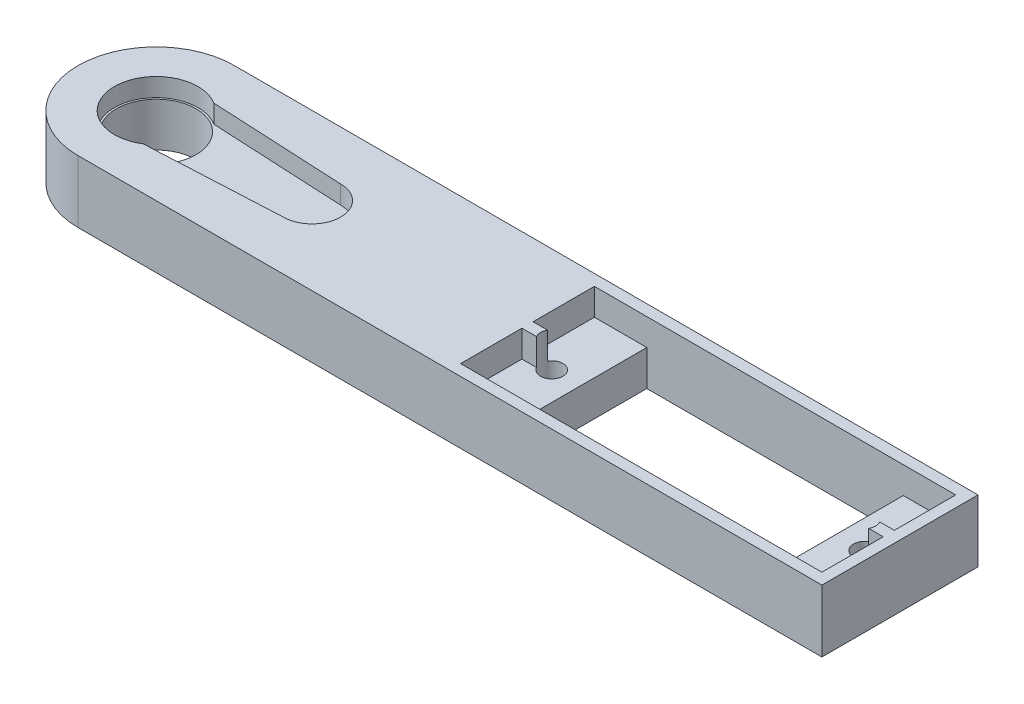
ISO-10303-21;
HEADER;
FILE_DESCRIPTION(('STEP AP214'),'2;1');
FILE_NAME('part.step','',(''),(''),'','','');
FILE_SCHEMA(('AUTOMOTIVE_DESIGN { 1 0 10303 214 1 1 1 1 }'));
ENDSEC;
DATA;
#1=APPLICATION_CONTEXT('core data for automotive mechanical design processes');
#2=APPLICATION_PROTOCOL_DEFINITION('international standard','automotive_design',2000,#1);
#3=PRODUCT_CONTEXT('',#1,'mechanical');
#4=PRODUCT('Part','Part','',(#3));
#5=PRODUCT_RELATED_PRODUCT_CATEGORY('part','',(#4));
#6=PRODUCT_DEFINITION_FORMATION('','',#4);
#7=PRODUCT_DEFINITION_CONTEXT('part definition',#1,'design');
#8=PRODUCT_DEFINITION('design','',#6,#7);
#9=PRODUCT_DEFINITION_SHAPE('','',#8);
#10=(LENGTH_UNIT() NAMED_UNIT(*) SI_UNIT(.MILLI.,.METRE.));
#11=(NAMED_UNIT(*) PLANE_ANGLE_UNIT() SI_UNIT($,.RADIAN.));
#12=(NAMED_UNIT(*) SI_UNIT($,.STERADIAN.) SOLID_ANGLE_UNIT());
#13=UNCERTAINTY_MEASURE_WITH_UNIT(LENGTH_MEASURE(1.E-05),#10,'distance_accuracy_value','');
#14=(GEOMETRIC_REPRESENTATION_CONTEXT(3) GLOBAL_UNCERTAINTY_ASSIGNED_CONTEXT((#13)) GLOBAL_UNIT_ASSIGNED_CONTEXT((#10,
#11,#12)) REPRESENTATION_CONTEXT('',''));
#15=CARTESIAN_POINT('',(0.,0.,0.));
#16=DIRECTION('',(0.,0.,1.));
#17=DIRECTION('',(1.,0.,0.));
#18=AXIS2_PLACEMENT_3D('',#15,#16,#17);
#19=CARTESIAN_POINT('',(61.,21.79,-6.));
#20=DIRECTION('',(0.,0.,-1.));
#21=DIRECTION('',(1.,0.,0.));
#22=AXIS2_PLACEMENT_3D('',#19,#20,#21);
#23=PLANE('',#22);
#24=DIRECTION('',(0.,1.,0.));
#25=VECTOR('',#24,1.);
#26=CARTESIAN_POINT('',(61.,-12.887590930814,-6.));
#27=LINE('',#26,#25);
#28=CARTESIAN_POINT('',(61.,0.,-6.));
#29=VERTEX_POINT('',#28);
#30=CARTESIAN_POINT('',(61.,3.19,-6.));
#31=VERTEX_POINT('',#30);
#32=EDGE_CURVE('E314',#29,#31,#27,.T.);
#33=ORIENTED_EDGE('',*,*,#32,.T.);
#34=DIRECTION('',(-1.,0.,0.));
#35=VECTOR('',#34,1.);
#36=CARTESIAN_POINT('',(0.,3.19,-6.));
#37=LINE('',#36,#35);
#38=CARTESIAN_POINT('',(65.7,3.19,-6.));
#39=VERTEX_POINT('',#38);
#40=EDGE_CURVE('E342',#39,#31,#37,.T.);
#41=ORIENTED_EDGE('',*,*,#40,.F.);
#42=DIRECTION('',(0.,1.,0.));
#43=VECTOR('',#42,1.);
#44=CARTESIAN_POINT('',(65.7,-9.69759093081403,-6.));
#45=LINE('',#44,#43);
#46=CARTESIAN_POINT('',(65.7,5.59,-6.));
#47=VERTEX_POINT('',#46);
#48=EDGE_CURVE('E116',#39,#47,#45,.T.);
#49=ORIENTED_EDGE('',*,*,#48,.T.);
#50=DIRECTION('',(-1.,0.,0.));
#51=VECTOR('',#50,1.);
#52=CARTESIAN_POINT('',(0.,5.59,-6.));
#53=LINE('',#52,#51);
#54=CARTESIAN_POINT('',(33.3,5.59,-6.));
#55=VERTEX_POINT('',#54);
#56=EDGE_CURVE('E107',#47,#55,#53,.T.);
#57=ORIENTED_EDGE('',*,*,#56,.T.);
#58=DIRECTION('',(0.,-1.,0.));
#59=VECTOR('',#58,1.);
#60=CARTESIAN_POINT('',(33.3,5.59,-6.));
#61=LINE('',#60,#59);
#62=CARTESIAN_POINT('',(33.3,3.19,-6.));
#63=VERTEX_POINT('',#62);
#64=EDGE_CURVE('E111',#55,#63,#61,.T.);
#65=ORIENTED_EDGE('',*,*,#64,.T.);
#66=DIRECTION('',(-1.,0.,0.));
#67=VECTOR('',#66,1.);
#68=CARTESIAN_POINT('',(49.5,3.19,-6.));
#69=LINE('',#68,#67);
#70=CARTESIAN_POINT('',(38.,3.19,-6.));
#71=VERTEX_POINT('',#70);
#72=EDGE_CURVE('E177',#71,#63,#69,.T.);
#73=ORIENTED_EDGE('',*,*,#72,.F.);
#74=DIRECTION('',(0.,-1.,0.));
#75=VECTOR('',#74,1.);
#76=CARTESIAN_POINT('',(38.,21.79,-6.));
#77=LINE('',#76,#75);
#78=CARTESIAN_POINT('',(38.,0.,-6.));
#79=VERTEX_POINT('',#78);
#80=EDGE_CURVE('E133',#71,#79,#77,.T.);
#81=ORIENTED_EDGE('',*,*,#80,.T.);
#82=DIRECTION('',(-1.,0.,0.));
#83=VECTOR('',#82,1.);
#84=CARTESIAN_POINT('',(0.,0.,-6.));
#85=LINE('',#84,#83);
#86=EDGE_CURVE('E68',#29,#79,#85,.T.);
#87=ORIENTED_EDGE('',*,*,#86,.F.);
#88=EDGE_LOOP('',(#33,#41,#49,#57,#65,#73,#81,#87));
#89=FACE_BOUND('',#88,.T.);
#90=ADVANCED_FACE('F41',(#89),#23,.F.);
#91=CARTESIAN_POINT('',(61.,21.79,6.));
#92=DIRECTION('',(0.,0.,1.));
#93=DIRECTION('',(-1.,0.,0.));
#94=AXIS2_PLACEMENT_3D('',#91,#92,#93);
#95=PLANE('',#94);
#96=DIRECTION('',(0.,1.,0.));
#97=VECTOR('',#96,1.);
#98=CARTESIAN_POINT('',(61.,-12.887590930814,6.));
#99=LINE('',#98,#97);
#100=CARTESIAN_POINT('',(61.,0.,6.));
#101=VERTEX_POINT('',#100);
#102=CARTESIAN_POINT('',(61.,3.19,6.));
#103=VERTEX_POINT('',#102);
#104=EDGE_CURVE('E317',#101,#103,#99,.T.);
#105=ORIENTED_EDGE('',*,*,#104,.F.);
#106=DIRECTION('',(1.,0.,0.));
#107=VECTOR('',#106,1.);
#108=CARTESIAN_POINT('',(0.,0.,6.));
#109=LINE('',#108,#107);
#110=CARTESIAN_POINT('',(38.,0.,6.));
#111=VERTEX_POINT('',#110);
#112=EDGE_CURVE('E214',#111,#101,#109,.T.);
#113=ORIENTED_EDGE('',*,*,#112,.F.);
#114=DIRECTION('',(0.,-1.,0.));
#115=VECTOR('',#114,1.);
#116=CARTESIAN_POINT('',(38.,21.79,6.));
#117=LINE('',#116,#115);
#118=CARTESIAN_POINT('',(38.,3.19,6.));
#119=VERTEX_POINT('',#118);
#120=EDGE_CURVE('E11',#119,#111,#117,.T.);
#121=ORIENTED_EDGE('',*,*,#120,.F.);
#122=DIRECTION('',(-1.,0.,0.));
#123=VECTOR('',#122,1.);
#124=CARTESIAN_POINT('',(49.5,3.19,6.));
#125=LINE('',#124,#123);
#126=CARTESIAN_POINT('',(33.3,3.19,6.));
#127=VERTEX_POINT('',#126);
#128=EDGE_CURVE('E51',#119,#127,#125,.T.);
#129=ORIENTED_EDGE('',*,*,#128,.T.);
#130=DIRECTION('',(0.,-1.,0.));
#131=VECTOR('',#130,1.);
#132=CARTESIAN_POINT('',(33.3,5.59,6.));
#133=LINE('',#132,#131);
#134=CARTESIAN_POINT('',(33.3,5.59,6.));
#135=VERTEX_POINT('',#134);
#136=EDGE_CURVE('E195',#135,#127,#133,.T.);
#137=ORIENTED_EDGE('',*,*,#136,.F.);
#138=DIRECTION('',(-1.,0.,0.));
#139=VECTOR('',#138,1.);
#140=CARTESIAN_POINT('',(49.5,5.59,6.));
#141=LINE('',#140,#139);
#142=CARTESIAN_POINT('',(65.7,5.59,6.));
#143=VERTEX_POINT('',#142);
#144=EDGE_CURVE('E155',#143,#135,#141,.T.);
#145=ORIENTED_EDGE('',*,*,#144,.F.);
#146=DIRECTION('',(0.,1.,0.));
#147=VECTOR('',#146,1.);
#148=CARTESIAN_POINT('',(65.7,-9.69759093081403,6.));
#149=LINE('',#148,#147);
#150=CARTESIAN_POINT('',(65.7,3.19,6.));
#151=VERTEX_POINT('',#150);
#152=EDGE_CURVE('E344',#151,#143,#149,.T.);
#153=ORIENTED_EDGE('',*,*,#152,.F.);
#154=DIRECTION('',(1.,0.,0.));
#155=VECTOR('',#154,1.);
#156=CARTESIAN_POINT('',(0.,3.19,6.));
#157=LINE('',#156,#155);
#158=EDGE_CURVE('E349',#103,#151,#157,.T.);
#159=ORIENTED_EDGE('',*,*,#158,.F.);
#160=EDGE_LOOP('',(#105,#113,#121,#129,#137,#145,#153,#159));
#161=FACE_BOUND('',#160,.T.);
#162=ADVANCED_FACE('F515',(#161),#95,.F.);
#163=CARTESIAN_POINT('',(0.,5.59,0.));
#164=DIRECTION('',(0.,1.,0.));
#165=DIRECTION('',(0.,0.,1.));
#166=AXIS2_PLACEMENT_3D('',#163,#164,#165);
#167=PLANE('',#166);
#168=CARTESIAN_POINT('',(63.5283546303813,5.59,0.));
#169=DIRECTION('',(0.,1.,0.));
#170=DIRECTION('',(0.,0.,1.));
#171=AXIS2_PLACEMENT_3D('',#168,#169,#170);
#172=CIRCLE('',#171,1.00000000000001);
#173=CARTESIAN_POINT('',(64.3943800341658,5.59,0.5));
#174=VERTEX_POINT('',#173);
#175=CARTESIAN_POINT('',(64.3943800341658,5.59,-0.5));
#176=VERTEX_POINT('',#175);
#177=EDGE_CURVE('E391',#174,#176,#172,.T.);
#178=ORIENTED_EDGE('',*,*,#177,.F.);
#179=DIRECTION('',(1.,0.,0.));
#180=VECTOR('',#179,1.);
#181=CARTESIAN_POINT('',(0.,5.59,0.499999999999984));
#182=LINE('',#181,#180);
#183=CARTESIAN_POINT('',(65.7,5.59,0.5));
#184=VERTEX_POINT('',#183);
#185=EDGE_CURVE('E318',#174,#184,#182,.T.);
#186=ORIENTED_EDGE('',*,*,#185,.T.);
#187=DIRECTION('',(0.,0.,-1.));
#188=VECTOR('',#187,1.);
#189=CARTESIAN_POINT('',(65.7,5.59,0.));
#190=LINE('',#189,#188);
#191=EDGE_CURVE('E378',#143,#184,#190,.T.);
#192=ORIENTED_EDGE('',*,*,#191,.F.);
#193=ORIENTED_EDGE('',*,*,#144,.T.);
#194=DIRECTION('',(0.,0.,-1.));
#195=VECTOR('',#194,1.);
#196=CARTESIAN_POINT('',(33.3,5.59,0.));
#197=LINE('',#196,#195);
#198=CARTESIAN_POINT('',(33.3,5.59,0.5));
#199=VERTEX_POINT('',#198);
#200=EDGE_CURVE('E144',#135,#199,#197,.T.);
#201=ORIENTED_EDGE('',*,*,#200,.T.);
#202=DIRECTION('',(1.,0.,0.));
#203=VECTOR('',#202,1.);
#204=CARTESIAN_POINT('',(49.5,5.59,0.499999999999996));
#205=LINE('',#204,#203);
#206=CARTESIAN_POINT('',(34.6056199658342,5.59,0.5));
#207=VERTEX_POINT('',#206);
#208=EDGE_CURVE('E143',#199,#207,#205,.T.);
#209=ORIENTED_EDGE('',*,*,#208,.T.);
#210=CARTESIAN_POINT('',(35.4716453696186,5.59,0.));
#211=DIRECTION('',(0.,1.,0.));
#212=DIRECTION('',(0.,0.,1.));
#213=AXIS2_PLACEMENT_3D('',#210,#211,#212);
#214=CIRCLE('',#213,1.00000000000001);
#215=CARTESIAN_POINT('',(34.6056199658342,5.59,-0.5));
#216=VERTEX_POINT('',#215);
#217=EDGE_CURVE('E392',#216,#207,#214,.T.);
#218=ORIENTED_EDGE('',*,*,#217,.F.);
#219=DIRECTION('',(1.,0.,0.));
#220=VECTOR('',#219,1.);
#221=CARTESIAN_POINT('',(49.5,5.59,-0.499999999999996));
#222=LINE('',#221,#220);
#223=CARTESIAN_POINT('',(33.3,5.59,-0.5));
#224=VERTEX_POINT('',#223);
#225=EDGE_CURVE('E45',#224,#216,#222,.T.);
#226=ORIENTED_EDGE('',*,*,#225,.F.);
#227=EDGE_CURVE('E128',#224,#55,#197,.T.);
#228=ORIENTED_EDGE('',*,*,#227,.T.);
#229=ORIENTED_EDGE('',*,*,#56,.F.);
#230=CARTESIAN_POINT('',(65.7,5.59,-0.5));
#231=VERTEX_POINT('',#230);
#232=EDGE_CURVE('E357',#231,#47,#190,.T.);
#233=ORIENTED_EDGE('',*,*,#232,.F.);
#234=DIRECTION('',(-1.,0.,0.));
#235=VECTOR('',#234,1.);
#236=CARTESIAN_POINT('',(0.,5.59,-0.499999999999984));
#237=LINE('',#236,#235);
#238=EDGE_CURVE('E339',#231,#176,#237,.T.);
#239=ORIENTED_EDGE('',*,*,#238,.T.);
#240=EDGE_LOOP('',(#178,#186,#192,#193,#201,#209,#218,#226,#228,#229,#233,#239));
#241=FACE_BOUND('',#240,.T.);
#242=DIRECTION('',(1.,0.,0.));
#243=VECTOR('',#242,1.);
#244=CARTESIAN_POINT('',(0.,5.59,7.));
#245=LINE('',#244,#243);
#246=CARTESIAN_POINT('',(0.,5.59,7.));
#247=VERTEX_POINT('',#246);
#248=CARTESIAN_POINT('',(66.7,5.59,7.));
#249=VERTEX_POINT('',#248);
#250=EDGE_CURVE('E271',#247,#249,#245,.T.);
#251=ORIENTED_EDGE('',*,*,#250,.T.);
#252=DIRECTION('',(0.,0.,-1.));
#253=VECTOR('',#252,1.);
#254=CARTESIAN_POINT('',(66.7,5.59,0.));
#255=LINE('',#254,#253);
#256=CARTESIAN_POINT('',(66.7,5.59,-7.));
#257=VERTEX_POINT('',#256);
#258=EDGE_CURVE('E306',#249,#257,#255,.T.);
#259=ORIENTED_EDGE('',*,*,#258,.T.);
#260=DIRECTION('',(-1.,0.,0.));
#261=VECTOR('',#260,1.);
#262=CARTESIAN_POINT('',(55.,5.59,-7.));
#263=LINE('',#262,#261);
#264=CARTESIAN_POINT('',(0.,5.59,-7.));
#265=VERTEX_POINT('',#264);
#266=EDGE_CURVE('E142',#257,#265,#263,.T.);
#267=ORIENTED_EDGE('',*,*,#266,.T.);
#268=CARTESIAN_POINT('',(0.,5.59,0.));
#269=DIRECTION('',(0.,1.,0.));
#270=DIRECTION('',(0.,0.,1.));
#271=AXIS2_PLACEMENT_3D('',#268,#269,#270);
#272=CIRCLE('',#271,7.);
#273=EDGE_CURVE('E148',#265,#247,#272,.T.);
#274=ORIENTED_EDGE('',*,*,#273,.T.);
#275=EDGE_LOOP('',(#251,#259,#267,#274));
#276=FACE_BOUND('',#275,.T.);
#277=DIRECTION('',(-0.99875866941023,0.,-0.0498108449828539));
#278=VECTOR('',#277,1.);
#279=CARTESIAN_POINT('',(13.9793089820932,5.59,-2.5699963876771));
#280=LINE('',#279,#278);
#281=CARTESIAN_POINT('',(13.9793089820932,5.59,-2.5699963876771));
#282=VERTEX_POINT('',#281);
#283=CARTESIAN_POINT('',(1.99792628223678,5.59,-3.16754093434442));
#284=VERTEX_POINT('',#283);
#285=EDGE_CURVE('E224',#282,#284,#280,.T.);
#286=ORIENTED_EDGE('',*,*,#285,.F.);
#287=CARTESIAN_POINT('',(13.975,5.59,0.));
#288=DIRECTION('',(0.,1.,0.));
#289=DIRECTION('',(0.,0.,1.));
#290=AXIS2_PLACEMENT_3D('',#287,#288,#289);
#291=CIRCLE('',#290,2.57);
#292=CARTESIAN_POINT('',(13.9793089820932,5.59,2.5699963876771));
#293=VERTEX_POINT('',#292);
#294=EDGE_CURVE('E219',#293,#282,#291,.T.);
#295=ORIENTED_EDGE('',*,*,#294,.F.);
#296=DIRECTION('',(0.99875866941023,0.,-0.0498108449828537));
#297=VECTOR('',#296,1.);
#298=CARTESIAN_POINT('',(1.99792628223678,5.59,3.16754093434442));
#299=LINE('',#298,#297);
#300=CARTESIAN_POINT('',(1.99792628223678,5.59,3.16754093434442));
#301=VERTEX_POINT('',#300);
#302=EDGE_CURVE('E234',#301,#293,#299,.T.);
#303=ORIENTED_EDGE('',*,*,#302,.F.);
#304=CARTESIAN_POINT('',(0.,5.59,0.));
#305=DIRECTION('',(0.,1.,0.));
#306=DIRECTION('',(0.,0.,-1.));
#307=AXIS2_PLACEMENT_3D('',#304,#305,#306);
#308=CIRCLE('',#307,3.745);
#309=EDGE_CURVE('E229',#284,#301,#308,.T.);
#310=ORIENTED_EDGE('',*,*,#309,.F.);
#311=EDGE_LOOP('',(#286,#295,#303,#310));
#312=FACE_BOUND('',#311,.T.);
#313=ADVANCED_FACE('F137',(#241,#276,#312),#167,.T.);
#314=CARTESIAN_POINT('',(0.,3.95,0.));
#315=DIRECTION('',(0.,1.,0.));
#316=DIRECTION('',(0.,0.,1.));
#317=AXIS2_PLACEMENT_3D('',#314,#315,#316);
#318=PLANE('',#317);
#319=CARTESIAN_POINT('',(0.,3.95,0.));
#320=DIRECTION('',(0.,-1.,0.));
#321=DIRECTION('',(0.,0.,-1.));
#322=AXIS2_PLACEMENT_3D('',#319,#320,#321);
#323=CIRCLE('',#322,3.575);
#324=CARTESIAN_POINT('',(0.,3.95,-3.575));
#325=VERTEX_POINT('',#324);
#326=EDGE_CURVE('E255',#325,#325,#323,.T.);
#327=ORIENTED_EDGE('',*,*,#326,.T.);
#328=EDGE_LOOP('',(#327));
#329=FACE_BOUND('',#328,.T.);
#330=DIRECTION('',(0.99875866941023,0.,-0.0498108449828537));
#331=VECTOR('',#330,1.);
#332=CARTESIAN_POINT('',(1.99792628223678,3.95,3.16754093434442));
#333=LINE('',#332,#331);
#334=CARTESIAN_POINT('',(1.99792628223678,3.95,3.16754093434442));
#335=VERTEX_POINT('',#334);
#336=CARTESIAN_POINT('',(13.9793089820932,3.95,2.5699963876771));
#337=VERTEX_POINT('',#336);
#338=EDGE_CURVE('E243',#335,#337,#333,.T.);
#339=ORIENTED_EDGE('',*,*,#338,.T.);
#340=CARTESIAN_POINT('',(13.975,3.95,0.));
#341=DIRECTION('',(0.,1.,0.));
#342=DIRECTION('',(0.,0.,1.));
#343=AXIS2_PLACEMENT_3D('',#340,#341,#342);
#344=CIRCLE('',#343,2.57);
#345=CARTESIAN_POINT('',(13.9793089820932,3.95,-2.5699963876771));
#346=VERTEX_POINT('',#345);
#347=EDGE_CURVE('E238',#337,#346,#344,.T.);
#348=ORIENTED_EDGE('',*,*,#347,.T.);
#349=DIRECTION('',(-0.99875866941023,0.,-0.0498108449828539));
#350=VECTOR('',#349,1.);
#351=CARTESIAN_POINT('',(13.9793089820932,3.95,-2.5699963876771));
#352=LINE('',#351,#350);
#353=CARTESIAN_POINT('',(1.99792628223678,3.95,-3.16754093434442));
#354=VERTEX_POINT('',#353);
#355=EDGE_CURVE('E242',#346,#354,#352,.T.);
#356=ORIENTED_EDGE('',*,*,#355,.T.);
#357=CARTESIAN_POINT('',(0.,3.95,0.));
#358=DIRECTION('',(0.,1.,0.));
#359=DIRECTION('',(0.,0.,-1.));
#360=AXIS2_PLACEMENT_3D('',#357,#358,#359);
#361=CIRCLE('',#360,3.745);
#362=EDGE_CURVE('E247',#354,#335,#361,.T.);
#363=ORIENTED_EDGE('',*,*,#362,.T.);
#364=EDGE_LOOP('',(#339,#348,#356,#363));
#365=FACE_BOUND('',#364,.T.);
#366=ADVANCED_FACE('F499',(#329,#365),#318,.T.);
#367=CARTESIAN_POINT('',(0.,3.95,0.));
#368=DIRECTION('',(0.,-1.,0.));
#369=DIRECTION('',(0.,0.,-1.));
#370=AXIS2_PLACEMENT_3D('',#367,#368,#369);
#371=CYLINDRICAL_SURFACE('',#370,7.);
#372=CARTESIAN_POINT('',(0.,0.,0.));
#373=DIRECTION('',(0.,1.,0.));
#374=DIRECTION('',(0.,0.,1.));
#375=AXIS2_PLACEMENT_3D('',#372,#373,#374);
#376=CIRCLE('',#375,7.);
#377=CARTESIAN_POINT('',(0.,0.,-7.));
#378=VERTEX_POINT('',#377);
#379=CARTESIAN_POINT('',(0.,0.,7.));
#380=VERTEX_POINT('',#379);
#381=EDGE_CURVE('E251',#378,#380,#376,.T.);
#382=ORIENTED_EDGE('',*,*,#381,.T.);
#383=DIRECTION('',(0.,-1.,0.));
#384=VECTOR('',#383,1.);
#385=CARTESIAN_POINT('',(0.,3.95,7.));
#386=LINE('',#385,#384);
#387=EDGE_CURVE('E289',#247,#380,#386,.T.);
#388=ORIENTED_EDGE('',*,*,#387,.F.);
#389=ORIENTED_EDGE('',*,*,#273,.F.);
#390=DIRECTION('',(0.,-1.,0.));
#391=VECTOR('',#390,1.);
#392=CARTESIAN_POINT('',(0.,3.95,-7.));
#393=LINE('',#392,#391);
#394=EDGE_CURVE('E284',#265,#378,#393,.T.);
#395=ORIENTED_EDGE('',*,*,#394,.T.);
#396=EDGE_LOOP('',(#382,#388,#389,#395));
#397=FACE_BOUND('',#396,.T.);
#398=ADVANCED_FACE('F648',(#397),#371,.T.);
#399=CARTESIAN_POINT('',(0.,3.95,7.));
#400=DIRECTION('',(0.,0.,-1.));
#401=DIRECTION('',(-1.,0.,0.));
#402=AXIS2_PLACEMENT_3D('',#399,#400,#401);
#403=PLANE('',#402);
#404=DIRECTION('',(1.,0.,0.));
#405=VECTOR('',#404,1.);
#406=CARTESIAN_POINT('',(0.,0.,7.));
#407=LINE('',#406,#405);
#408=CARTESIAN_POINT('',(66.7,0.,7.));
#409=VERTEX_POINT('',#408);
#410=EDGE_CURVE('E285',#380,#409,#407,.T.);
#411=ORIENTED_EDGE('',*,*,#410,.T.);
#412=DIRECTION('',(0.,1.,0.));
#413=VECTOR('',#412,1.);
#414=CARTESIAN_POINT('',(66.7,-36.2154663092994,7.));
#415=LINE('',#414,#413);
#416=EDGE_CURVE('E164',#409,#249,#415,.T.);
#417=ORIENTED_EDGE('',*,*,#416,.T.);
#418=ORIENTED_EDGE('',*,*,#250,.F.);
#419=ORIENTED_EDGE('',*,*,#387,.T.);
#420=EDGE_LOOP('',(#411,#417,#418,#419));
#421=FACE_BOUND('',#420,.T.);
#422=ADVANCED_FACE('F643',(#421),#403,.F.);
#423=CARTESIAN_POINT('',(0.,3.95,-7.));
#424=DIRECTION('',(0.,0.,1.));
#425=DIRECTION('',(1.,0.,0.));
#426=AXIS2_PLACEMENT_3D('',#423,#424,#425);
#427=PLANE('',#426);
#428=ORIENTED_EDGE('',*,*,#394,.F.);
#429=ORIENTED_EDGE('',*,*,#266,.F.);
#430=DIRECTION('',(0.,1.,0.));
#431=VECTOR('',#430,1.);
#432=CARTESIAN_POINT('',(66.7,-36.2154663092994,-7.));
#433=LINE('',#432,#431);
#434=CARTESIAN_POINT('',(66.7,0.,-7.));
#435=VERTEX_POINT('',#434);
#436=EDGE_CURVE('E302',#435,#257,#433,.T.);
#437=ORIENTED_EDGE('',*,*,#436,.F.);
#438=DIRECTION('',(-1.,0.,0.));
#439=VECTOR('',#438,1.);
#440=CARTESIAN_POINT('',(0.,0.,-7.));
#441=LINE('',#440,#439);
#442=EDGE_CURVE('E290',#435,#378,#441,.T.);
#443=ORIENTED_EDGE('',*,*,#442,.T.);
#444=EDGE_LOOP('',(#428,#429,#437,#443));
#445=FACE_BOUND('',#444,.T.);
#446=ADVANCED_FACE('F580',(#445),#427,.F.);
#447=CARTESIAN_POINT('',(0.,0.,0.));
#448=DIRECTION('',(0.,1.,0.));
#449=DIRECTION('',(0.,0.,1.));
#450=AXIS2_PLACEMENT_3D('',#447,#448,#449);
#451=PLANE('',#450);
#452=CARTESIAN_POINT('',(63.5283546303813,0.,0.));
#453=DIRECTION('',(0.,1.,0.));
#454=DIRECTION('',(0.,0.,1.));
#455=AXIS2_PLACEMENT_3D('',#452,#453,#454);
#456=CIRCLE('',#455,1.00000000000001);
#457=CARTESIAN_POINT('',(63.5283546303813,0.,1.00000000000001));
#458=VERTEX_POINT('',#457);
#459=EDGE_CURVE('E374',#458,#458,#456,.F.);
#460=ORIENTED_EDGE('',*,*,#459,.F.);
#461=EDGE_LOOP('',(#460));
#462=FACE_BOUND('',#461,.T.);
#463=CARTESIAN_POINT('',(35.4716453696186,0.,0.));
#464=DIRECTION('',(0.,1.,0.));
#465=DIRECTION('',(0.,0.,1.));
#466=AXIS2_PLACEMENT_3D('',#463,#464,#465);
#467=CIRCLE('',#466,1.00000000000001);
#468=CARTESIAN_POINT('',(35.4716453696186,0.,1.00000000000001));
#469=VERTEX_POINT('',#468);
#470=EDGE_CURVE('E387',#469,#469,#467,.F.);
#471=ORIENTED_EDGE('',*,*,#470,.F.);
#472=EDGE_LOOP('',(#471));
#473=FACE_BOUND('',#472,.T.);
#474=DIRECTION('',(0.,0.,1.));
#475=VECTOR('',#474,1.);
#476=CARTESIAN_POINT('',(61.,0.,0.));
#477=LINE('',#476,#475);
#478=EDGE_CURVE('E312',#29,#101,#477,.T.);
#479=ORIENTED_EDGE('',*,*,#478,.F.);
#480=ORIENTED_EDGE('',*,*,#86,.T.);
#481=DIRECTION('',(0.,0.,1.));
#482=VECTOR('',#481,1.);
#483=CARTESIAN_POINT('',(38.,0.,0.));
#484=LINE('',#483,#482);
#485=EDGE_CURVE('E218',#79,#111,#484,.T.);
#486=ORIENTED_EDGE('',*,*,#485,.T.);
#487=ORIENTED_EDGE('',*,*,#112,.T.);
#488=EDGE_LOOP('',(#479,#480,#486,#487));
#489=FACE_BOUND('',#488,.T.);
#490=DIRECTION('',(0.,0.,1.));
#491=VECTOR('',#490,1.);
#492=CARTESIAN_POINT('',(66.7,0.,0.));
#493=LINE('',#492,#491);
#494=EDGE_CURVE('E158',#435,#409,#493,.T.);
#495=ORIENTED_EDGE('',*,*,#494,.T.);
#496=ORIENTED_EDGE('',*,*,#410,.F.);
#497=ORIENTED_EDGE('',*,*,#381,.F.);
#498=ORIENTED_EDGE('',*,*,#442,.F.);
#499=EDGE_LOOP('',(#495,#496,#497,#498));
#500=FACE_BOUND('',#499,.T.);
#501=CARTESIAN_POINT('',(0.,0.,0.));
#502=DIRECTION('',(0.,-1.,0.));
#503=DIRECTION('',(0.,0.,-1.));
#504=AXIS2_PLACEMENT_3D('',#501,#502,#503);
#505=CIRCLE('',#504,3.575);
#506=CARTESIAN_POINT('',(0.,0.,-3.575));
#507=VERTEX_POINT('',#506);
#508=EDGE_CURVE('E213',#507,#507,#505,.T.);
#509=ORIENTED_EDGE('',*,*,#508,.F.);
#510=EDGE_LOOP('',(#509));
#511=FACE_BOUND('',#510,.T.);
#512=ADVANCED_FACE('F43',(#462,#473,#489,#500,#511),#451,.F.);
#513=CARTESIAN_POINT('',(0.,3.95,0.));
#514=DIRECTION('',(0.,-1.,0.));
#515=DIRECTION('',(0.,0.,-1.));
#516=AXIS2_PLACEMENT_3D('',#513,#514,#515);
#517=CYLINDRICAL_SURFACE('',#516,3.575);
#518=ORIENTED_EDGE('',*,*,#326,.F.);
#519=EDGE_LOOP('',(#518));
#520=FACE_BOUND('',#519,.T.);
#521=ORIENTED_EDGE('',*,*,#508,.T.);
#522=EDGE_LOOP('',(#521));
#523=FACE_BOUND('',#522,.T.);
#524=ADVANCED_FACE('F579',(#520,#523),#517,.F.);
#525=CARTESIAN_POINT('',(13.975,5.59,0.));
#526=DIRECTION('',(0.,-1.,0.));
#527=DIRECTION('',(0.,0.,-1.));
#528=AXIS2_PLACEMENT_3D('',#525,#526,#527);
#529=CYLINDRICAL_SURFACE('',#528,2.57);
#530=ORIENTED_EDGE('',*,*,#347,.F.);
#531=DIRECTION('',(0.,-1.,0.));
#532=VECTOR('',#531,1.);
#533=CARTESIAN_POINT('',(13.9793089820932,5.59,2.5699963876771));
#534=LINE('',#533,#532);
#535=EDGE_CURVE('E172',#293,#337,#534,.T.);
#536=ORIENTED_EDGE('',*,*,#535,.F.);
#537=ORIENTED_EDGE('',*,*,#294,.T.);
#538=DIRECTION('',(0.,-1.,0.));
#539=VECTOR('',#538,1.);
#540=CARTESIAN_POINT('',(13.9793089820932,5.59,-2.5699963876771));
#541=LINE('',#540,#539);
#542=EDGE_CURVE('E223',#282,#346,#541,.T.);
#543=ORIENTED_EDGE('',*,*,#542,.T.);
#544=EDGE_LOOP('',(#530,#536,#537,#543));
#545=FACE_BOUND('',#544,.T.);
#546=ADVANCED_FACE('F486',(#545),#529,.F.);
#547=CARTESIAN_POINT('',(13.9793089820932,5.59,-2.5699963876771));
#548=DIRECTION('',(-0.0498108449828539,0.,0.99875866941023));
#549=DIRECTION('',(0.998758669410231,0.,0.0498108449828539));
#550=AXIS2_PLACEMENT_3D('',#547,#548,#549);
#551=PLANE('',#550);
#552=ORIENTED_EDGE('',*,*,#355,.F.);
#553=ORIENTED_EDGE('',*,*,#542,.F.);
#554=ORIENTED_EDGE('',*,*,#285,.T.);
#555=DIRECTION('',(0.,-1.,0.));
#556=VECTOR('',#555,1.);
#557=CARTESIAN_POINT('',(1.99792628223678,5.59,-3.16754093434442));
#558=LINE('',#557,#556);
#559=EDGE_CURVE('E228',#284,#354,#558,.T.);
#560=ORIENTED_EDGE('',*,*,#559,.T.);
#561=EDGE_LOOP('',(#552,#553,#554,#560));
#562=FACE_BOUND('',#561,.T.);
#563=ADVANCED_FACE('F491',(#562),#551,.T.);
#564=CARTESIAN_POINT('',(0.,5.59,0.));
#565=DIRECTION('',(0.,-1.,0.));
#566=DIRECTION('',(0.,0.,-1.));
#567=AXIS2_PLACEMENT_3D('',#564,#565,#566);
#568=CYLINDRICAL_SURFACE('',#567,3.745);
#569=ORIENTED_EDGE('',*,*,#362,.F.);
#570=ORIENTED_EDGE('',*,*,#559,.F.);
#571=ORIENTED_EDGE('',*,*,#309,.T.);
#572=DIRECTION('',(0.,-1.,0.));
#573=VECTOR('',#572,1.);
#574=CARTESIAN_POINT('',(1.99792628223678,5.59,3.16754093434442));
#575=LINE('',#574,#573);
#576=EDGE_CURVE('E233',#301,#335,#575,.T.);
#577=ORIENTED_EDGE('',*,*,#576,.T.);
#578=EDGE_LOOP('',(#569,#570,#571,#577));
#579=FACE_BOUND('',#578,.T.);
#580=ADVANCED_FACE('F496',(#579),#568,.F.);
#581=CARTESIAN_POINT('',(1.99792628223678,5.59,3.16754093434442));
#582=DIRECTION('',(-0.0498108449828537,0.,-0.99875866941023));
#583=DIRECTION('',(-0.998758669410231,0.,0.0498108449828537));
#584=AXIS2_PLACEMENT_3D('',#581,#582,#583);
#585=PLANE('',#584);
#586=ORIENTED_EDGE('',*,*,#338,.F.);
#587=ORIENTED_EDGE('',*,*,#576,.F.);
#588=ORIENTED_EDGE('',*,*,#302,.T.);
#589=ORIENTED_EDGE('',*,*,#535,.T.);
#590=EDGE_LOOP('',(#586,#587,#588,#589));
#591=FACE_BOUND('',#590,.T.);
#592=ADVANCED_FACE('F501',(#591),#585,.T.);
#593=CARTESIAN_POINT('',(49.5,3.19,0.));
#594=DIRECTION('',(0.,-1.,0.));
#595=DIRECTION('',(0.,0.,1.));
#596=AXIS2_PLACEMENT_3D('',#593,#594,#595);
#597=PLANE('',#596);
#598=CARTESIAN_POINT('',(35.4716453696186,3.19,0.));
#599=DIRECTION('',(0.,-1.,0.));
#600=DIRECTION('',(0.,0.,1.));
#601=AXIS2_PLACEMENT_3D('',#598,#599,#600);
#602=CIRCLE('',#601,1.);
#603=CARTESIAN_POINT('',(34.6056199658342,3.19,-0.500000000000001));
#604=VERTEX_POINT('',#603);
#605=CARTESIAN_POINT('',(34.6056199658342,3.19,0.5));
#606=VERTEX_POINT('',#605);
#607=EDGE_CURVE('E167',#604,#606,#602,.T.);
#608=ORIENTED_EDGE('',*,*,#607,.T.);
#609=DIRECTION('',(1.,0.,0.));
#610=VECTOR('',#609,1.);
#611=CARTESIAN_POINT('',(49.5,3.19,0.499999999999996));
#612=LINE('',#611,#610);
#613=CARTESIAN_POINT('',(33.3,3.19,0.5));
#614=VERTEX_POINT('',#613);
#615=EDGE_CURVE('E190',#614,#606,#612,.T.);
#616=ORIENTED_EDGE('',*,*,#615,.F.);
#617=DIRECTION('',(0.,0.,-1.));
#618=VECTOR('',#617,1.);
#619=CARTESIAN_POINT('',(33.3,3.19,0.));
#620=LINE('',#619,#618);
#621=EDGE_CURVE('E182',#127,#614,#620,.T.);
#622=ORIENTED_EDGE('',*,*,#621,.F.);
#623=ORIENTED_EDGE('',*,*,#128,.F.);
#624=DIRECTION('',(0.,0.,-1.));
#625=VECTOR('',#624,1.);
#626=CARTESIAN_POINT('',(38.,3.19,0.));
#627=LINE('',#626,#625);
#628=EDGE_CURVE('E171',#119,#71,#627,.T.);
#629=ORIENTED_EDGE('',*,*,#628,.T.);
#630=ORIENTED_EDGE('',*,*,#72,.T.);
#631=CARTESIAN_POINT('',(33.3,3.19,-0.5));
#632=VERTEX_POINT('',#631);
#633=EDGE_CURVE('E131',#632,#63,#620,.T.);
#634=ORIENTED_EDGE('',*,*,#633,.F.);
#635=DIRECTION('',(1.,0.,0.));
#636=VECTOR('',#635,1.);
#637=CARTESIAN_POINT('',(49.5,3.19,-0.499999999999996));
#638=LINE('',#637,#636);
#639=EDGE_CURVE('E173',#632,#604,#638,.T.);
#640=ORIENTED_EDGE('',*,*,#639,.T.);
#641=EDGE_LOOP('',(#608,#616,#622,#623,#629,#630,#634,#640));
#642=FACE_BOUND('',#641,.T.);
#643=ADVANCED_FACE('F503',(#642),#597,.F.);
#644=CARTESIAN_POINT('',(49.5,5.59,-0.499999999999996));
#645=DIRECTION('',(0.,0.,-1.));
#646=DIRECTION('',(1.,0.,0.));
#647=AXIS2_PLACEMENT_3D('',#644,#645,#646);
#648=PLANE('',#647);
#649=ORIENTED_EDGE('',*,*,#639,.F.);
#650=DIRECTION('',(0.,-1.,0.));
#651=VECTOR('',#650,1.);
#652=CARTESIAN_POINT('',(33.3,5.59,-0.5));
#653=LINE('',#652,#651);
#654=EDGE_CURVE('E180',#224,#632,#653,.T.);
#655=ORIENTED_EDGE('',*,*,#654,.F.);
#656=ORIENTED_EDGE('',*,*,#225,.T.);
#657=DIRECTION('',(0.,-1.,0.));
#658=VECTOR('',#657,1.);
#659=CARTESIAN_POINT('',(34.6056199658342,5.59,-0.5));
#660=LINE('',#659,#658);
#661=EDGE_CURVE('E181',#216,#604,#660,.T.);
#662=ORIENTED_EDGE('',*,*,#661,.T.);
#663=EDGE_LOOP('',(#649,#655,#656,#662));
#664=FACE_BOUND('',#663,.T.);
#665=ADVANCED_FACE('F510',(#664),#648,.T.);
#666=CARTESIAN_POINT('',(33.3,5.59,0.));
#667=DIRECTION('',(-1.,0.,0.));
#668=DIRECTION('',(0.,0.,-1.));
#669=AXIS2_PLACEMENT_3D('',#666,#667,#668);
#670=PLANE('',#669);
#671=ORIENTED_EDGE('',*,*,#633,.T.);
#672=ORIENTED_EDGE('',*,*,#64,.F.);
#673=ORIENTED_EDGE('',*,*,#227,.F.);
#674=ORIENTED_EDGE('',*,*,#654,.T.);
#675=EDGE_LOOP('',(#671,#672,#673,#674));
#676=FACE_BOUND('',#675,.T.);
#677=ADVANCED_FACE('F127',(#676),#670,.F.);
#678=ORIENTED_EDGE('',*,*,#621,.T.);
#679=DIRECTION('',(0.,-1.,0.));
#680=VECTOR('',#679,1.);
#681=CARTESIAN_POINT('',(33.3,5.59,0.5));
#682=LINE('',#681,#680);
#683=EDGE_CURVE('E194',#199,#614,#682,.T.);
#684=ORIENTED_EDGE('',*,*,#683,.F.);
#685=ORIENTED_EDGE('',*,*,#200,.F.);
#686=ORIENTED_EDGE('',*,*,#136,.T.);
#687=EDGE_LOOP('',(#678,#684,#685,#686));
#688=FACE_BOUND('',#687,.T.);
#689=ADVANCED_FACE('F528',(#688),#670,.F.);
#690=CARTESIAN_POINT('',(49.5,5.59,0.499999999999996));
#691=DIRECTION('',(0.,0.,-1.));
#692=DIRECTION('',(1.,0.,0.));
#693=AXIS2_PLACEMENT_3D('',#690,#691,#692);
#694=PLANE('',#693);
#695=ORIENTED_EDGE('',*,*,#615,.T.);
#696=DIRECTION('',(0.,-1.,0.));
#697=VECTOR('',#696,1.);
#698=CARTESIAN_POINT('',(34.6056199658342,5.59,0.5));
#699=LINE('',#698,#697);
#700=EDGE_CURVE('E122',#207,#606,#699,.T.);
#701=ORIENTED_EDGE('',*,*,#700,.F.);
#702=ORIENTED_EDGE('',*,*,#208,.F.);
#703=ORIENTED_EDGE('',*,*,#683,.T.);
#704=EDGE_LOOP('',(#695,#701,#702,#703));
#705=FACE_BOUND('',#704,.T.);
#706=ADVANCED_FACE('F531',(#705),#694,.F.);
#707=CARTESIAN_POINT('',(38.,21.79,6.));
#708=DIRECTION('',(-1.,0.,0.));
#709=DIRECTION('',(0.,0.,-1.));
#710=AXIS2_PLACEMENT_3D('',#707,#708,#709);
#711=PLANE('',#710);
#712=ORIENTED_EDGE('',*,*,#80,.F.);
#713=ORIENTED_EDGE('',*,*,#628,.F.);
#714=ORIENTED_EDGE('',*,*,#120,.T.);
#715=ORIENTED_EDGE('',*,*,#485,.F.);
#716=EDGE_LOOP('',(#712,#713,#714,#715));
#717=FACE_BOUND('',#716,.T.);
#718=ADVANCED_FACE('F523',(#717),#711,.F.);
#719=CARTESIAN_POINT('',(66.7,-36.2154663092994,0.));
#720=DIRECTION('',(1.,0.,0.));
#721=DIRECTION('',(0.,0.,-1.));
#722=AXIS2_PLACEMENT_3D('',#719,#720,#721);
#723=PLANE('',#722);
#724=ORIENTED_EDGE('',*,*,#494,.F.);
#725=ORIENTED_EDGE('',*,*,#436,.T.);
#726=ORIENTED_EDGE('',*,*,#258,.F.);
#727=ORIENTED_EDGE('',*,*,#416,.F.);
#728=EDGE_LOOP('',(#724,#725,#726,#727));
#729=FACE_BOUND('',#728,.T.);
#730=ADVANCED_FACE('F538',(#729),#723,.T.);
#731=CARTESIAN_POINT('',(61.,-12.887590930814,0.));
#732=DIRECTION('',(1.,0.,0.));
#733=DIRECTION('',(0.,0.,-1.));
#734=AXIS2_PLACEMENT_3D('',#731,#732,#733);
#735=PLANE('',#734);
#736=ORIENTED_EDGE('',*,*,#104,.T.);
#737=DIRECTION('',(0.,0.,-1.));
#738=VECTOR('',#737,1.);
#739=CARTESIAN_POINT('',(61.,3.19,0.));
#740=LINE('',#739,#738);
#741=EDGE_CURVE('E59',#103,#31,#740,.T.);
#742=ORIENTED_EDGE('',*,*,#741,.T.);
#743=ORIENTED_EDGE('',*,*,#32,.F.);
#744=ORIENTED_EDGE('',*,*,#478,.T.);
#745=EDGE_LOOP('',(#736,#742,#743,#744));
#746=FACE_BOUND('',#745,.T.);
#747=ADVANCED_FACE('F572',(#746),#735,.F.);
#748=CARTESIAN_POINT('',(49.5,3.19,0.));
#749=DIRECTION('',(0.,-1.,0.));
#750=DIRECTION('',(0.,0.,1.));
#751=AXIS2_PLACEMENT_3D('',#748,#749,#750);
#752=PLANE('',#751);
#753=CARTESIAN_POINT('',(63.5283546303813,3.19,0.));
#754=DIRECTION('',(0.,-1.,0.));
#755=DIRECTION('',(0.,0.,-1.));
#756=AXIS2_PLACEMENT_3D('',#753,#754,#755);
#757=CIRCLE('',#756,1.);
#758=CARTESIAN_POINT('',(64.3943800341658,3.19,0.5));
#759=VERTEX_POINT('',#758);
#760=CARTESIAN_POINT('',(64.3943800341658,3.19,-0.500000000000001));
#761=VERTEX_POINT('',#760);
#762=EDGE_CURVE('E335',#759,#761,#757,.T.);
#763=ORIENTED_EDGE('',*,*,#762,.T.);
#764=DIRECTION('',(-1.,0.,0.));
#765=VECTOR('',#764,1.);
#766=CARTESIAN_POINT('',(0.,3.19,-0.499999999999984));
#767=LINE('',#766,#765);
#768=CARTESIAN_POINT('',(65.7,3.19,-0.5));
#769=VERTEX_POINT('',#768);
#770=EDGE_CURVE('E353',#769,#761,#767,.T.);
#771=ORIENTED_EDGE('',*,*,#770,.F.);
#772=DIRECTION('',(0.,0.,-1.));
#773=VECTOR('',#772,1.);
#774=CARTESIAN_POINT('',(65.7,3.19,0.));
#775=LINE('',#774,#773);
#776=EDGE_CURVE('E343',#769,#39,#775,.T.);
#777=ORIENTED_EDGE('',*,*,#776,.T.);
#778=ORIENTED_EDGE('',*,*,#40,.T.);
#779=ORIENTED_EDGE('',*,*,#741,.F.);
#780=ORIENTED_EDGE('',*,*,#158,.T.);
#781=DIRECTION('',(0.,0.,-1.));
#782=VECTOR('',#781,1.);
#783=CARTESIAN_POINT('',(65.7,3.19,0.));
#784=LINE('',#783,#782);
#785=CARTESIAN_POINT('',(65.7,3.19,0.5));
#786=VERTEX_POINT('',#785);
#787=EDGE_CURVE('E348',#151,#786,#784,.T.);
#788=ORIENTED_EDGE('',*,*,#787,.T.);
#789=DIRECTION('',(1.,0.,0.));
#790=VECTOR('',#789,1.);
#791=CARTESIAN_POINT('',(0.,3.19,0.499999999999984));
#792=LINE('',#791,#790);
#793=EDGE_CURVE('E365',#759,#786,#792,.T.);
#794=ORIENTED_EDGE('',*,*,#793,.F.);
#795=EDGE_LOOP('',(#763,#771,#777,#778,#779,#780,#788,#794));
#796=FACE_BOUND('',#795,.T.);
#797=ADVANCED_FACE('F567',(#796),#752,.F.);
#798=CARTESIAN_POINT('',(0.,-9.69759093081403,-0.499999999999984));
#799=DIRECTION('',(0.,0.,-1.));
#800=DIRECTION('',(-1.,0.,0.));
#801=AXIS2_PLACEMENT_3D('',#798,#799,#800);
#802=PLANE('',#801);
#803=ORIENTED_EDGE('',*,*,#770,.T.);
#804=DIRECTION('',(0.,1.,0.));
#805=VECTOR('',#804,1.);
#806=CARTESIAN_POINT('',(64.3943800341658,-9.69759093081403,-0.5));
#807=LINE('',#806,#805);
#808=EDGE_CURVE('E330',#761,#176,#807,.T.);
#809=ORIENTED_EDGE('',*,*,#808,.T.);
#810=ORIENTED_EDGE('',*,*,#238,.F.);
#811=DIRECTION('',(0.,1.,0.));
#812=VECTOR('',#811,1.);
#813=CARTESIAN_POINT('',(65.7,-9.69759093081403,-0.5));
#814=LINE('',#813,#812);
#815=EDGE_CURVE('E334',#769,#231,#814,.T.);
#816=ORIENTED_EDGE('',*,*,#815,.F.);
#817=EDGE_LOOP('',(#803,#809,#810,#816));
#818=FACE_BOUND('',#817,.T.);
#819=ADVANCED_FACE('F413',(#818),#802,.T.);
#820=CARTESIAN_POINT('',(65.7,-9.69759093081403,0.));
#821=DIRECTION('',(1.,0.,0.));
#822=DIRECTION('',(0.,0.,-1.));
#823=AXIS2_PLACEMENT_3D('',#820,#821,#822);
#824=PLANE('',#823);
#825=ORIENTED_EDGE('',*,*,#815,.T.);
#826=ORIENTED_EDGE('',*,*,#232,.T.);
#827=ORIENTED_EDGE('',*,*,#48,.F.);
#828=ORIENTED_EDGE('',*,*,#776,.F.);
#829=EDGE_LOOP('',(#825,#826,#827,#828));
#830=FACE_BOUND('',#829,.T.);
#831=ADVANCED_FACE('F420',(#830),#824,.F.);
#832=ORIENTED_EDGE('',*,*,#152,.T.);
#833=ORIENTED_EDGE('',*,*,#191,.T.);
#834=DIRECTION('',(0.,1.,0.));
#835=VECTOR('',#834,1.);
#836=CARTESIAN_POINT('',(65.7,-9.69759093081403,0.5));
#837=LINE('',#836,#835);
#838=EDGE_CURVE('E329',#786,#184,#837,.T.);
#839=ORIENTED_EDGE('',*,*,#838,.F.);
#840=ORIENTED_EDGE('',*,*,#787,.F.);
#841=EDGE_LOOP('',(#832,#833,#839,#840));
#842=FACE_BOUND('',#841,.T.);
#843=ADVANCED_FACE('F563',(#842),#824,.F.);
#844=CARTESIAN_POINT('',(0.,-9.69759093081403,0.499999999999984));
#845=DIRECTION('',(0.,0.,1.));
#846=DIRECTION('',(1.,0.,0.));
#847=AXIS2_PLACEMENT_3D('',#844,#845,#846);
#848=PLANE('',#847);
#849=ORIENTED_EDGE('',*,*,#793,.T.);
#850=ORIENTED_EDGE('',*,*,#838,.T.);
#851=ORIENTED_EDGE('',*,*,#185,.F.);
#852=DIRECTION('',(0.,1.,0.));
#853=VECTOR('',#852,1.);
#854=CARTESIAN_POINT('',(64.3943800341658,-9.69759093081403,0.5));
#855=LINE('',#854,#853);
#856=EDGE_CURVE('E325',#759,#174,#855,.T.);
#857=ORIENTED_EDGE('',*,*,#856,.F.);
#858=EDGE_LOOP('',(#849,#850,#851,#857));
#859=FACE_BOUND('',#858,.T.);
#860=ADVANCED_FACE('F560',(#859),#848,.T.);
#861=CARTESIAN_POINT('',(63.5283546303813,-2.82842712474623,0.));
#862=DIRECTION('',(0.,1.,0.));
#863=DIRECTION('',(0.,0.,1.));
#864=AXIS2_PLACEMENT_3D('',#861,#862,#863);
#865=CYLINDRICAL_SURFACE('',#864,1.00000000000001);
#866=ORIENTED_EDGE('',*,*,#808,.F.);
#867=ORIENTED_EDGE('',*,*,#762,.F.);
#868=ORIENTED_EDGE('',*,*,#856,.T.);
#869=ORIENTED_EDGE('',*,*,#177,.T.);
#870=EDGE_LOOP('',(#866,#867,#868,#869));
#871=FACE_BOUND('',#870,.T.);
#872=ORIENTED_EDGE('',*,*,#459,.T.);
#873=EDGE_LOOP('',(#872));
#874=FACE_BOUND('',#873,.T.);
#875=ADVANCED_FACE('F403',(#871,#874),#865,.F.);
#876=CARTESIAN_POINT('',(35.4716453696186,-2.82842712474623,0.));
#877=DIRECTION('',(0.,1.,0.));
#878=DIRECTION('',(0.,0.,1.));
#879=AXIS2_PLACEMENT_3D('',#876,#877,#878);
#880=CYLINDRICAL_SURFACE('',#879,1.00000000000001);
#881=ORIENTED_EDGE('',*,*,#661,.F.);
#882=ORIENTED_EDGE('',*,*,#217,.T.);
#883=ORIENTED_EDGE('',*,*,#700,.T.);
#884=ORIENTED_EDGE('',*,*,#607,.F.);
#885=EDGE_LOOP('',(#881,#882,#883,#884));
#886=FACE_BOUND('',#885,.T.);
#887=ORIENTED_EDGE('',*,*,#470,.T.);
#888=EDGE_LOOP('',(#887));
#889=FACE_BOUND('',#888,.T.);
#890=ADVANCED_FACE('F553',(#886,#889),#880,.F.);
#891=CLOSED_SHELL('',(#90,#162,#313,#366,#398,#422,#446,#512,#524,#546,#563,#580,#592,#643,#665,
#677,#689,#706,#718,#730,#747,#797,#819,#831,#843,#860,#875,#890));
#892=MANIFOLD_SOLID_BREP('B2',#891);
#893=ADVANCED_BREP_SHAPE_REPRESENTATION('',(#18,#892),#14);
#894=SHAPE_DEFINITION_REPRESENTATION(#9,#893);
ENDSEC;
END-ISO-10303-21;
